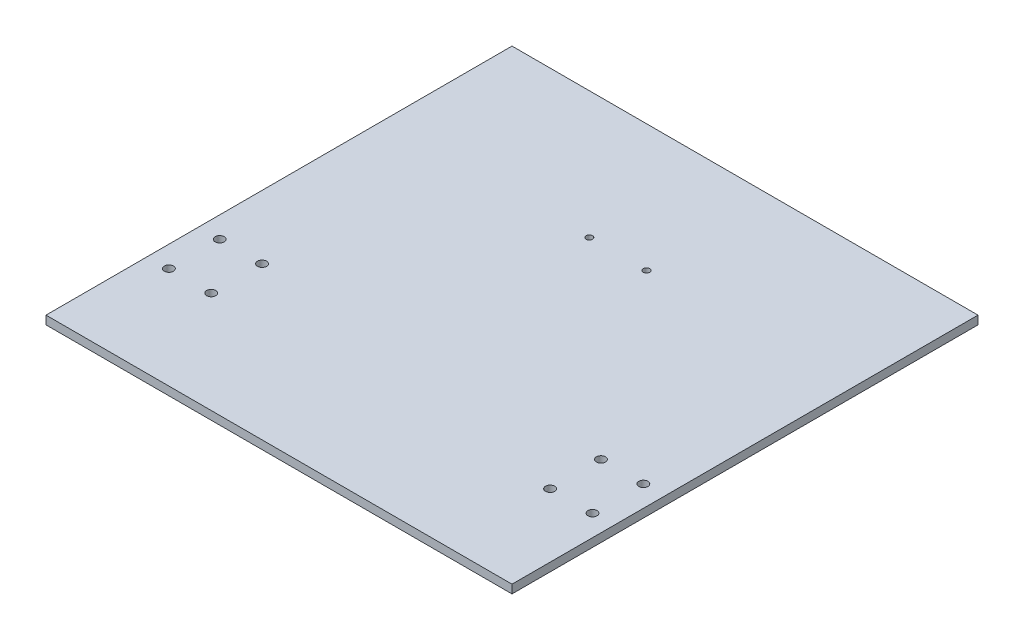
ISO-10303-21;
HEADER;
FILE_DESCRIPTION(('STEP AP214'),'2;1');
FILE_NAME('part.step','',(''),(''),'','','');
FILE_SCHEMA(('AUTOMOTIVE_DESIGN { 1 0 10303 214 1 1 1 1 }'));
ENDSEC;
DATA;
#1=APPLICATION_CONTEXT('core data for automotive mechanical design processes');
#2=APPLICATION_PROTOCOL_DEFINITION('international standard','automotive_design',2000,#1);
#3=PRODUCT_CONTEXT('',#1,'mechanical');
#4=PRODUCT('Part','Part','',(#3));
#5=PRODUCT_RELATED_PRODUCT_CATEGORY('part','',(#4));
#6=PRODUCT_DEFINITION_FORMATION('','',#4);
#7=PRODUCT_DEFINITION_CONTEXT('part definition',#1,'design');
#8=PRODUCT_DEFINITION('design','',#6,#7);
#9=PRODUCT_DEFINITION_SHAPE('','',#8);
#10=(LENGTH_UNIT() NAMED_UNIT(*) SI_UNIT(.MILLI.,.METRE.));
#11=(NAMED_UNIT(*) PLANE_ANGLE_UNIT() SI_UNIT($,.RADIAN.));
#12=(NAMED_UNIT(*) SI_UNIT($,.STERADIAN.) SOLID_ANGLE_UNIT());
#13=UNCERTAINTY_MEASURE_WITH_UNIT(LENGTH_MEASURE(1.E-05),#10,'distance_accuracy_value','');
#14=(GEOMETRIC_REPRESENTATION_CONTEXT(3) GLOBAL_UNCERTAINTY_ASSIGNED_CONTEXT((#13)) GLOBAL_UNIT_ASSIGNED_CONTEXT((#10,
#11,#12)) REPRESENTATION_CONTEXT('',''));
#15=CARTESIAN_POINT('',(0.,0.,0.));
#16=DIRECTION('',(0.,0.,1.));
#17=DIRECTION('',(1.,0.,0.));
#18=AXIS2_PLACEMENT_3D('',#15,#16,#17);
#19=CARTESIAN_POINT('',(0.,4.,0.));
#20=DIRECTION('',(0.,1.,0.));
#21=DIRECTION('',(0.,0.,1.));
#22=AXIS2_PLACEMENT_3D('',#19,#20,#21);
#23=PLANE('',#22);
#24=CARTESIAN_POINT('',(80.,4.,38.));
#25=DIRECTION('',(0.,1.,0.));
#26=DIRECTION('',(0.,0.,-1.));
#27=AXIS2_PLACEMENT_3D('',#24,#25,#26);
#28=CIRCLE('',#27,2.15);
#29=CARTESIAN_POINT('',(80.,4.,35.85));
#30=VERTEX_POINT('',#29);
#31=EDGE_CURVE('E196',#30,#30,#28,.T.);
#32=ORIENTED_EDGE('',*,*,#31,.F.);
#33=EDGE_LOOP('',(#32));
#34=FACE_BOUND('',#33,.T.);
#35=CARTESIAN_POINT('',(100.,4.,62.));
#36=DIRECTION('',(0.,1.,0.));
#37=DIRECTION('',(0.,0.,-1.));
#38=AXIS2_PLACEMENT_3D('',#35,#36,#37);
#39=CIRCLE('',#38,2.15);
#40=CARTESIAN_POINT('',(100.,4.,59.85));
#41=VERTEX_POINT('',#40);
#42=EDGE_CURVE('E180',#41,#41,#39,.T.);
#43=ORIENTED_EDGE('',*,*,#42,.F.);
#44=EDGE_LOOP('',(#43));
#45=FACE_BOUND('',#44,.T.);
#46=CARTESIAN_POINT('',(-100.,4.,62.));
#47=DIRECTION('',(0.,1.,0.));
#48=DIRECTION('',(0.,0.,1.));
#49=AXIS2_PLACEMENT_3D('',#46,#47,#48);
#50=CIRCLE('',#49,2.15);
#51=CARTESIAN_POINT('',(-100.,4.,64.15));
#52=VERTEX_POINT('',#51);
#53=EDGE_CURVE('E164',#52,#52,#50,.T.);
#54=ORIENTED_EDGE('',*,*,#53,.F.);
#55=EDGE_LOOP('',(#54));
#56=FACE_BOUND('',#55,.T.);
#57=CARTESIAN_POINT('',(-80.,4.,38.));
#58=DIRECTION('',(0.,1.,0.));
#59=DIRECTION('',(0.,0.,1.));
#60=AXIS2_PLACEMENT_3D('',#57,#58,#59);
#61=CIRCLE('',#60,2.15);
#62=CARTESIAN_POINT('',(-80.,4.,40.15));
#63=VERTEX_POINT('',#62);
#64=EDGE_CURVE('E148',#63,#63,#61,.T.);
#65=ORIENTED_EDGE('',*,*,#64,.F.);
#66=EDGE_LOOP('',(#65));
#67=FACE_BOUND('',#66,.T.);
#68=CARTESIAN_POINT('',(-13.5,4.,-50.));
#69=DIRECTION('',(0.,1.,0.));
#70=DIRECTION('',(0.,0.,1.));
#71=AXIS2_PLACEMENT_3D('',#68,#69,#70);
#72=CIRCLE('',#71,1.5);
#73=CARTESIAN_POINT('',(-13.5,4.,-48.5));
#74=VERTEX_POINT('',#73);
#75=EDGE_CURVE('E118',#74,#74,#72,.T.);
#76=ORIENTED_EDGE('',*,*,#75,.F.);
#77=EDGE_LOOP('',(#76));
#78=FACE_BOUND('',#77,.T.);
#79=DIRECTION('',(0.,0.,-1.));
#80=VECTOR('',#79,1.);
#81=CARTESIAN_POINT('',(110.,4.,-110.));
#82=LINE('',#81,#80);
#83=CARTESIAN_POINT('',(110.,4.,110.));
#84=VERTEX_POINT('',#83);
#85=CARTESIAN_POINT('',(110.,4.,-110.));
#86=VERTEX_POINT('',#85);
#87=EDGE_CURVE('E98',#84,#86,#82,.T.);
#88=ORIENTED_EDGE('',*,*,#87,.T.);
#89=DIRECTION('',(-1.,0.,0.));
#90=VECTOR('',#89,1.);
#91=CARTESIAN_POINT('',(-110.,4.,-110.));
#92=LINE('',#91,#90);
#93=CARTESIAN_POINT('',(-110.,4.,-110.));
#94=VERTEX_POINT('',#93);
#95=EDGE_CURVE('E93',#86,#94,#92,.T.);
#96=ORIENTED_EDGE('',*,*,#95,.T.);
#97=DIRECTION('',(0.,0.,1.));
#98=VECTOR('',#97,1.);
#99=CARTESIAN_POINT('',(-110.,4.,110.));
#100=LINE('',#99,#98);
#101=CARTESIAN_POINT('',(-110.,4.,110.));
#102=VERTEX_POINT('',#101);
#103=EDGE_CURVE('E96',#94,#102,#100,.T.);
#104=ORIENTED_EDGE('',*,*,#103,.T.);
#105=DIRECTION('',(1.,0.,0.));
#106=VECTOR('',#105,1.);
#107=CARTESIAN_POINT('',(-110.,4.,110.));
#108=LINE('',#107,#106);
#109=EDGE_CURVE('E63',#102,#84,#108,.T.);
#110=ORIENTED_EDGE('',*,*,#109,.T.);
#111=EDGE_LOOP('',(#88,#96,#104,#110));
#112=FACE_BOUND('',#111,.T.);
#113=CARTESIAN_POINT('',(-100.,4.,38.));
#114=DIRECTION('',(0.,1.,0.));
#115=DIRECTION('',(0.,0.,1.));
#116=AXIS2_PLACEMENT_3D('',#113,#114,#115);
#117=CIRCLE('',#116,2.15);
#118=CARTESIAN_POINT('',(-100.,4.,40.15));
#119=VERTEX_POINT('',#118);
#120=EDGE_CURVE('E140',#119,#119,#117,.T.);
#121=ORIENTED_EDGE('',*,*,#120,.F.);
#122=EDGE_LOOP('',(#121));
#123=FACE_BOUND('',#122,.T.);
#124=CARTESIAN_POINT('',(-80.,4.,62.));
#125=DIRECTION('',(0.,1.,0.));
#126=DIRECTION('',(0.,0.,1.));
#127=AXIS2_PLACEMENT_3D('',#124,#125,#126);
#128=CIRCLE('',#127,2.15);
#129=CARTESIAN_POINT('',(-80.,4.,64.15));
#130=VERTEX_POINT('',#129);
#131=EDGE_CURVE('E156',#130,#130,#128,.T.);
#132=ORIENTED_EDGE('',*,*,#131,.F.);
#133=EDGE_LOOP('',(#132));
#134=FACE_BOUND('',#133,.T.);
#135=CARTESIAN_POINT('',(13.5,4.,-50.));
#136=DIRECTION('',(0.,1.,0.));
#137=DIRECTION('',(0.,0.,-1.));
#138=AXIS2_PLACEMENT_3D('',#135,#136,#137);
#139=CIRCLE('',#138,1.49999999999996);
#140=CARTESIAN_POINT('',(13.5,4.,-51.5));
#141=VERTEX_POINT('',#140);
#142=EDGE_CURVE('E172',#141,#141,#139,.T.);
#143=ORIENTED_EDGE('',*,*,#142,.F.);
#144=EDGE_LOOP('',(#143));
#145=FACE_BOUND('',#144,.T.);
#146=CARTESIAN_POINT('',(80.,4.,62.));
#147=DIRECTION('',(0.,1.,0.));
#148=DIRECTION('',(0.,0.,-1.));
#149=AXIS2_PLACEMENT_3D('',#146,#147,#148);
#150=CIRCLE('',#149,2.15);
#151=CARTESIAN_POINT('',(80.,4.,59.85));
#152=VERTEX_POINT('',#151);
#153=EDGE_CURVE('E188',#152,#152,#150,.T.);
#154=ORIENTED_EDGE('',*,*,#153,.F.);
#155=EDGE_LOOP('',(#154));
#156=FACE_BOUND('',#155,.T.);
#157=CARTESIAN_POINT('',(100.,4.,38.));
#158=DIRECTION('',(0.,1.,0.));
#159=DIRECTION('',(0.,0.,-1.));
#160=AXIS2_PLACEMENT_3D('',#157,#158,#159);
#161=CIRCLE('',#160,2.15);
#162=CARTESIAN_POINT('',(100.,4.,35.85));
#163=VERTEX_POINT('',#162);
#164=EDGE_CURVE('E204',#163,#163,#161,.T.);
#165=ORIENTED_EDGE('',*,*,#164,.F.);
#166=EDGE_LOOP('',(#165));
#167=FACE_BOUND('',#166,.T.);
#168=ADVANCED_FACE('F45',(#34,#45,#56,#67,#78,#112,#123,#134,#145,#156,#167),#23,.T.);
#169=CARTESIAN_POINT('',(0.,0.,0.));
#170=DIRECTION('',(0.,1.,0.));
#171=DIRECTION('',(0.,0.,1.));
#172=AXIS2_PLACEMENT_3D('',#169,#170,#171);
#173=PLANE('',#172);
#174=DIRECTION('',(0.,0.,-1.));
#175=VECTOR('',#174,1.);
#176=CARTESIAN_POINT('',(110.,0.,-110.));
#177=LINE('',#176,#175);
#178=CARTESIAN_POINT('',(110.,0.,110.));
#179=VERTEX_POINT('',#178);
#180=CARTESIAN_POINT('',(110.,0.,-110.));
#181=VERTEX_POINT('',#180);
#182=EDGE_CURVE('E114',#179,#181,#177,.T.);
#183=ORIENTED_EDGE('',*,*,#182,.F.);
#184=DIRECTION('',(1.,0.,0.));
#185=VECTOR('',#184,1.);
#186=CARTESIAN_POINT('',(-110.,0.,110.));
#187=LINE('',#186,#185);
#188=CARTESIAN_POINT('',(-110.,0.,110.));
#189=VERTEX_POINT('',#188);
#190=EDGE_CURVE('E86',#189,#179,#187,.T.);
#191=ORIENTED_EDGE('',*,*,#190,.F.);
#192=DIRECTION('',(0.,0.,1.));
#193=VECTOR('',#192,1.);
#194=CARTESIAN_POINT('',(-110.,0.,110.));
#195=LINE('',#194,#193);
#196=CARTESIAN_POINT('',(-110.,0.,-110.));
#197=VERTEX_POINT('',#196);
#198=EDGE_CURVE('E80',#197,#189,#195,.T.);
#199=ORIENTED_EDGE('',*,*,#198,.F.);
#200=DIRECTION('',(-1.,0.,0.));
#201=VECTOR('',#200,1.);
#202=CARTESIAN_POINT('',(-110.,0.,-110.));
#203=LINE('',#202,#201);
#204=EDGE_CURVE('E103',#181,#197,#203,.T.);
#205=ORIENTED_EDGE('',*,*,#204,.F.);
#206=EDGE_LOOP('',(#183,#191,#199,#205));
#207=FACE_BOUND('',#206,.T.);
#208=CARTESIAN_POINT('',(-13.5,0.,-50.));
#209=DIRECTION('',(0.,1.,0.));
#210=DIRECTION('',(0.,0.,1.));
#211=AXIS2_PLACEMENT_3D('',#208,#209,#210);
#212=CIRCLE('',#211,1.5);
#213=CARTESIAN_POINT('',(-13.5,0.,-48.5));
#214=VERTEX_POINT('',#213);
#215=EDGE_CURVE('E136',#214,#214,#212,.T.);
#216=ORIENTED_EDGE('',*,*,#215,.T.);
#217=EDGE_LOOP('',(#216));
#218=FACE_BOUND('',#217,.T.);
#219=CARTESIAN_POINT('',(-100.,0.,38.));
#220=DIRECTION('',(0.,1.,0.));
#221=DIRECTION('',(0.,0.,1.));
#222=AXIS2_PLACEMENT_3D('',#219,#220,#221);
#223=CIRCLE('',#222,2.15);
#224=CARTESIAN_POINT('',(-100.,0.,40.15));
#225=VERTEX_POINT('',#224);
#226=EDGE_CURVE('E144',#225,#225,#223,.T.);
#227=ORIENTED_EDGE('',*,*,#226,.T.);
#228=EDGE_LOOP('',(#227));
#229=FACE_BOUND('',#228,.T.);
#230=CARTESIAN_POINT('',(-80.,0.,38.));
#231=DIRECTION('',(0.,1.,0.));
#232=DIRECTION('',(0.,0.,1.));
#233=AXIS2_PLACEMENT_3D('',#230,#231,#232);
#234=CIRCLE('',#233,2.15);
#235=CARTESIAN_POINT('',(-80.,0.,40.15));
#236=VERTEX_POINT('',#235);
#237=EDGE_CURVE('E152',#236,#236,#234,.T.);
#238=ORIENTED_EDGE('',*,*,#237,.T.);
#239=EDGE_LOOP('',(#238));
#240=FACE_BOUND('',#239,.T.);
#241=CARTESIAN_POINT('',(-80.,0.,62.));
#242=DIRECTION('',(0.,1.,0.));
#243=DIRECTION('',(0.,0.,1.));
#244=AXIS2_PLACEMENT_3D('',#241,#242,#243);
#245=CIRCLE('',#244,2.15);
#246=CARTESIAN_POINT('',(-80.,0.,64.15));
#247=VERTEX_POINT('',#246);
#248=EDGE_CURVE('E160',#247,#247,#245,.T.);
#249=ORIENTED_EDGE('',*,*,#248,.T.);
#250=EDGE_LOOP('',(#249));
#251=FACE_BOUND('',#250,.T.);
#252=CARTESIAN_POINT('',(-100.,0.,62.));
#253=DIRECTION('',(0.,1.,0.));
#254=DIRECTION('',(0.,0.,1.));
#255=AXIS2_PLACEMENT_3D('',#252,#253,#254);
#256=CIRCLE('',#255,2.15);
#257=CARTESIAN_POINT('',(-100.,0.,64.15));
#258=VERTEX_POINT('',#257);
#259=EDGE_CURVE('E168',#258,#258,#256,.T.);
#260=ORIENTED_EDGE('',*,*,#259,.T.);
#261=EDGE_LOOP('',(#260));
#262=FACE_BOUND('',#261,.T.);
#263=CARTESIAN_POINT('',(13.5,0.,-50.));
#264=DIRECTION('',(0.,1.,0.));
#265=DIRECTION('',(0.,0.,-1.));
#266=AXIS2_PLACEMENT_3D('',#263,#264,#265);
#267=CIRCLE('',#266,1.49999999999996);
#268=CARTESIAN_POINT('',(13.5,0.,-51.5));
#269=VERTEX_POINT('',#268);
#270=EDGE_CURVE('E176',#269,#269,#267,.T.);
#271=ORIENTED_EDGE('',*,*,#270,.T.);
#272=EDGE_LOOP('',(#271));
#273=FACE_BOUND('',#272,.T.);
#274=CARTESIAN_POINT('',(100.,0.,62.));
#275=DIRECTION('',(0.,1.,0.));
#276=DIRECTION('',(0.,0.,-1.));
#277=AXIS2_PLACEMENT_3D('',#274,#275,#276);
#278=CIRCLE('',#277,2.15);
#279=CARTESIAN_POINT('',(100.,0.,59.85));
#280=VERTEX_POINT('',#279);
#281=EDGE_CURVE('E184',#280,#280,#278,.T.);
#282=ORIENTED_EDGE('',*,*,#281,.T.);
#283=EDGE_LOOP('',(#282));
#284=FACE_BOUND('',#283,.T.);
#285=CARTESIAN_POINT('',(80.,0.,62.));
#286=DIRECTION('',(0.,1.,0.));
#287=DIRECTION('',(0.,0.,-1.));
#288=AXIS2_PLACEMENT_3D('',#285,#286,#287);
#289=CIRCLE('',#288,2.15);
#290=CARTESIAN_POINT('',(80.,0.,59.85));
#291=VERTEX_POINT('',#290);
#292=EDGE_CURVE('E192',#291,#291,#289,.T.);
#293=ORIENTED_EDGE('',*,*,#292,.T.);
#294=EDGE_LOOP('',(#293));
#295=FACE_BOUND('',#294,.T.);
#296=CARTESIAN_POINT('',(80.,0.,38.));
#297=DIRECTION('',(0.,1.,0.));
#298=DIRECTION('',(0.,0.,-1.));
#299=AXIS2_PLACEMENT_3D('',#296,#297,#298);
#300=CIRCLE('',#299,2.15);
#301=CARTESIAN_POINT('',(80.,0.,35.85));
#302=VERTEX_POINT('',#301);
#303=EDGE_CURVE('E200',#302,#302,#300,.T.);
#304=ORIENTED_EDGE('',*,*,#303,.T.);
#305=EDGE_LOOP('',(#304));
#306=FACE_BOUND('',#305,.T.);
#307=CARTESIAN_POINT('',(100.,0.,38.));
#308=DIRECTION('',(0.,1.,0.));
#309=DIRECTION('',(0.,0.,-1.));
#310=AXIS2_PLACEMENT_3D('',#307,#308,#309);
#311=CIRCLE('',#310,2.15);
#312=CARTESIAN_POINT('',(100.,0.,35.85));
#313=VERTEX_POINT('',#312);
#314=EDGE_CURVE('E208',#313,#313,#311,.T.);
#315=ORIENTED_EDGE('',*,*,#314,.T.);
#316=EDGE_LOOP('',(#315));
#317=FACE_BOUND('',#316,.T.);
#318=ADVANCED_FACE('F131',(#207,#218,#229,#240,#251,#262,#273,#284,#295,#306,#317),#173,.F.);
#319=CARTESIAN_POINT('',(110.,4.,-110.));
#320=DIRECTION('',(-1.,0.,0.));
#321=DIRECTION('',(0.,0.,1.));
#322=AXIS2_PLACEMENT_3D('',#319,#320,#321);
#323=PLANE('',#322);
#324=ORIENTED_EDGE('',*,*,#182,.T.);
#325=DIRECTION('',(0.,-1.,0.));
#326=VECTOR('',#325,1.);
#327=CARTESIAN_POINT('',(110.,4.,-110.));
#328=LINE('',#327,#326);
#329=EDGE_CURVE('E11',#86,#181,#328,.T.);
#330=ORIENTED_EDGE('',*,*,#329,.F.);
#331=ORIENTED_EDGE('',*,*,#87,.F.);
#332=DIRECTION('',(0.,-1.,0.));
#333=VECTOR('',#332,1.);
#334=CARTESIAN_POINT('',(110.,4.,110.));
#335=LINE('',#334,#333);
#336=EDGE_CURVE('E110',#84,#179,#335,.T.);
#337=ORIENTED_EDGE('',*,*,#336,.T.);
#338=EDGE_LOOP('',(#324,#330,#331,#337));
#339=FACE_BOUND('',#338,.T.);
#340=ADVANCED_FACE('F47',(#339),#323,.F.);
#341=CARTESIAN_POINT('',(-110.,4.,-110.));
#342=DIRECTION('',(0.,0.,1.));
#343=DIRECTION('',(1.,0.,0.));
#344=AXIS2_PLACEMENT_3D('',#341,#342,#343);
#345=PLANE('',#344);
#346=ORIENTED_EDGE('',*,*,#204,.T.);
#347=DIRECTION('',(0.,-1.,0.));
#348=VECTOR('',#347,1.);
#349=CARTESIAN_POINT('',(-110.,4.,-110.));
#350=LINE('',#349,#348);
#351=EDGE_CURVE('E55',#94,#197,#350,.T.);
#352=ORIENTED_EDGE('',*,*,#351,.F.);
#353=ORIENTED_EDGE('',*,*,#95,.F.);
#354=ORIENTED_EDGE('',*,*,#329,.T.);
#355=EDGE_LOOP('',(#346,#352,#353,#354));
#356=FACE_BOUND('',#355,.T.);
#357=ADVANCED_FACE('F102',(#356),#345,.F.);
#358=CARTESIAN_POINT('',(-110.,4.,110.));
#359=DIRECTION('',(1.,0.,0.));
#360=DIRECTION('',(0.,0.,-1.));
#361=AXIS2_PLACEMENT_3D('',#358,#359,#360);
#362=PLANE('',#361);
#363=ORIENTED_EDGE('',*,*,#198,.T.);
#364=DIRECTION('',(0.,-1.,0.));
#365=VECTOR('',#364,1.);
#366=CARTESIAN_POINT('',(-110.,4.,110.));
#367=LINE('',#366,#365);
#368=EDGE_CURVE('E105',#102,#189,#367,.T.);
#369=ORIENTED_EDGE('',*,*,#368,.F.);
#370=ORIENTED_EDGE('',*,*,#103,.F.);
#371=ORIENTED_EDGE('',*,*,#351,.T.);
#372=EDGE_LOOP('',(#363,#369,#370,#371));
#373=FACE_BOUND('',#372,.T.);
#374=ADVANCED_FACE('F106',(#373),#362,.F.);
#375=CARTESIAN_POINT('',(-110.,4.,110.));
#376=DIRECTION('',(0.,0.,-1.));
#377=DIRECTION('',(-1.,0.,0.));
#378=AXIS2_PLACEMENT_3D('',#375,#376,#377);
#379=PLANE('',#378);
#380=ORIENTED_EDGE('',*,*,#190,.T.);
#381=ORIENTED_EDGE('',*,*,#336,.F.);
#382=ORIENTED_EDGE('',*,*,#109,.F.);
#383=ORIENTED_EDGE('',*,*,#368,.T.);
#384=EDGE_LOOP('',(#380,#381,#382,#383));
#385=FACE_BOUND('',#384,.T.);
#386=ADVANCED_FACE('F128',(#385),#379,.F.);
#387=CARTESIAN_POINT('',(-13.5,4.,-50.));
#388=DIRECTION('',(0.,-1.,0.));
#389=DIRECTION('',(0.,0.,-1.));
#390=AXIS2_PLACEMENT_3D('',#387,#388,#389);
#391=CYLINDRICAL_SURFACE('',#390,1.5);
#392=ORIENTED_EDGE('',*,*,#75,.T.);
#393=EDGE_LOOP('',(#392));
#394=FACE_BOUND('',#393,.T.);
#395=ORIENTED_EDGE('',*,*,#215,.F.);
#396=EDGE_LOOP('',(#395));
#397=FACE_BOUND('',#396,.T.);
#398=ADVANCED_FACE('F229',(#394,#397),#391,.F.);
#399=CARTESIAN_POINT('',(-100.,4.,38.));
#400=DIRECTION('',(0.,-1.,0.));
#401=DIRECTION('',(0.,0.,-1.));
#402=AXIS2_PLACEMENT_3D('',#399,#400,#401);
#403=CYLINDRICAL_SURFACE('',#402,2.15);
#404=ORIENTED_EDGE('',*,*,#120,.T.);
#405=EDGE_LOOP('',(#404));
#406=FACE_BOUND('',#405,.T.);
#407=ORIENTED_EDGE('',*,*,#226,.F.);
#408=EDGE_LOOP('',(#407));
#409=FACE_BOUND('',#408,.T.);
#410=ADVANCED_FACE('F274',(#406,#409),#403,.F.);
#411=CARTESIAN_POINT('',(-80.,4.,38.));
#412=DIRECTION('',(0.,-1.,0.));
#413=DIRECTION('',(0.,0.,-1.));
#414=AXIS2_PLACEMENT_3D('',#411,#412,#413);
#415=CYLINDRICAL_SURFACE('',#414,2.15);
#416=ORIENTED_EDGE('',*,*,#64,.T.);
#417=EDGE_LOOP('',(#416));
#418=FACE_BOUND('',#417,.T.);
#419=ORIENTED_EDGE('',*,*,#237,.F.);
#420=EDGE_LOOP('',(#419));
#421=FACE_BOUND('',#420,.T.);
#422=ADVANCED_FACE('F282',(#418,#421),#415,.F.);
#423=CARTESIAN_POINT('',(-80.,4.,62.));
#424=DIRECTION('',(0.,-1.,0.));
#425=DIRECTION('',(0.,0.,-1.));
#426=AXIS2_PLACEMENT_3D('',#423,#424,#425);
#427=CYLINDRICAL_SURFACE('',#426,2.15);
#428=ORIENTED_EDGE('',*,*,#131,.T.);
#429=EDGE_LOOP('',(#428));
#430=FACE_BOUND('',#429,.T.);
#431=ORIENTED_EDGE('',*,*,#248,.F.);
#432=EDGE_LOOP('',(#431));
#433=FACE_BOUND('',#432,.T.);
#434=ADVANCED_FACE('F290',(#430,#433),#427,.F.);
#435=CARTESIAN_POINT('',(-100.,4.,62.));
#436=DIRECTION('',(0.,-1.,0.));
#437=DIRECTION('',(0.,0.,-1.));
#438=AXIS2_PLACEMENT_3D('',#435,#436,#437);
#439=CYLINDRICAL_SURFACE('',#438,2.15);
#440=ORIENTED_EDGE('',*,*,#53,.T.);
#441=EDGE_LOOP('',(#440));
#442=FACE_BOUND('',#441,.T.);
#443=ORIENTED_EDGE('',*,*,#259,.F.);
#444=EDGE_LOOP('',(#443));
#445=FACE_BOUND('',#444,.T.);
#446=ADVANCED_FACE('F299',(#442,#445),#439,.F.);
#447=CARTESIAN_POINT('',(13.5,4.,-50.));
#448=DIRECTION('',(0.,-1.,0.));
#449=DIRECTION('',(0.,0.,-1.));
#450=AXIS2_PLACEMENT_3D('',#447,#448,#449);
#451=CYLINDRICAL_SURFACE('',#450,1.49999999999996);
#452=ORIENTED_EDGE('',*,*,#142,.T.);
#453=EDGE_LOOP('',(#452));
#454=FACE_BOUND('',#453,.T.);
#455=ORIENTED_EDGE('',*,*,#270,.F.);
#456=EDGE_LOOP('',(#455));
#457=FACE_BOUND('',#456,.T.);
#458=ADVANCED_FACE('F308',(#454,#457),#451,.F.);
#459=CARTESIAN_POINT('',(100.,4.,62.));
#460=DIRECTION('',(0.,-1.,0.));
#461=DIRECTION('',(0.,0.,-1.));
#462=AXIS2_PLACEMENT_3D('',#459,#460,#461);
#463=CYLINDRICAL_SURFACE('',#462,2.15);
#464=ORIENTED_EDGE('',*,*,#42,.T.);
#465=EDGE_LOOP('',(#464));
#466=FACE_BOUND('',#465,.T.);
#467=ORIENTED_EDGE('',*,*,#281,.F.);
#468=EDGE_LOOP('',(#467));
#469=FACE_BOUND('',#468,.T.);
#470=ADVANCED_FACE('F317',(#466,#469),#463,.F.);
#471=CARTESIAN_POINT('',(80.,4.,62.));
#472=DIRECTION('',(0.,-1.,0.));
#473=DIRECTION('',(0.,0.,-1.));
#474=AXIS2_PLACEMENT_3D('',#471,#472,#473);
#475=CYLINDRICAL_SURFACE('',#474,2.15);
#476=ORIENTED_EDGE('',*,*,#153,.T.);
#477=EDGE_LOOP('',(#476));
#478=FACE_BOUND('',#477,.T.);
#479=ORIENTED_EDGE('',*,*,#292,.F.);
#480=EDGE_LOOP('',(#479));
#481=FACE_BOUND('',#480,.T.);
#482=ADVANCED_FACE('F326',(#478,#481),#475,.F.);
#483=CARTESIAN_POINT('',(80.,4.,38.));
#484=DIRECTION('',(0.,-1.,0.));
#485=DIRECTION('',(0.,0.,-1.));
#486=AXIS2_PLACEMENT_3D('',#483,#484,#485);
#487=CYLINDRICAL_SURFACE('',#486,2.15);
#488=ORIENTED_EDGE('',*,*,#31,.T.);
#489=EDGE_LOOP('',(#488));
#490=FACE_BOUND('',#489,.T.);
#491=ORIENTED_EDGE('',*,*,#303,.F.);
#492=EDGE_LOOP('',(#491));
#493=FACE_BOUND('',#492,.T.);
#494=ADVANCED_FACE('F335',(#490,#493),#487,.F.);
#495=CARTESIAN_POINT('',(100.,4.,38.));
#496=DIRECTION('',(0.,-1.,0.));
#497=DIRECTION('',(0.,0.,-1.));
#498=AXIS2_PLACEMENT_3D('',#495,#496,#497);
#499=CYLINDRICAL_SURFACE('',#498,2.15);
#500=ORIENTED_EDGE('',*,*,#164,.T.);
#501=EDGE_LOOP('',(#500));
#502=FACE_BOUND('',#501,.T.);
#503=ORIENTED_EDGE('',*,*,#314,.F.);
#504=EDGE_LOOP('',(#503));
#505=FACE_BOUND('',#504,.T.);
#506=ADVANCED_FACE('F216',(#502,#505),#499,.F.);
#507=CLOSED_SHELL('',(#168,#318,#340,#357,#374,#386,#398,#410,#422,#434,#446,#458,#470,#482,
#494,#506));
#508=MANIFOLD_SOLID_BREP('B2',#507);
#509=ADVANCED_BREP_SHAPE_REPRESENTATION('',(#18,#508),#14);
#510=SHAPE_DEFINITION_REPRESENTATION(#9,#509);
ENDSEC;
END-ISO-10303-21;
